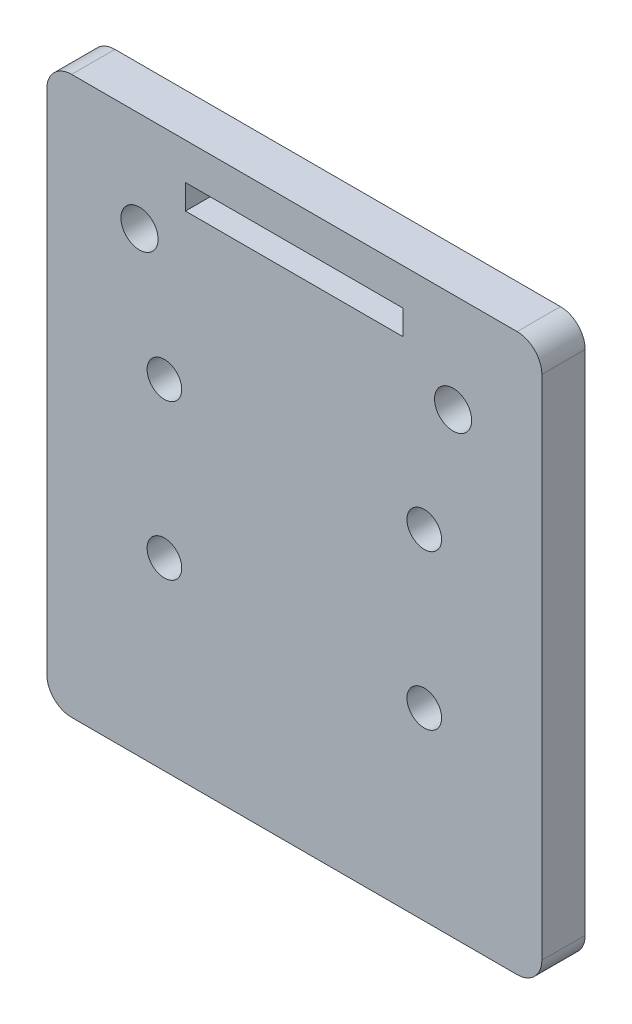
ISO-10303-21;
HEADER;
FILE_DESCRIPTION(('STEP AP214'),'2;1');
FILE_NAME('part.step','',(''),(''),'','','');
FILE_SCHEMA(('AUTOMOTIVE_DESIGN { 1 0 10303 214 1 1 1 1 }'));
ENDSEC;
DATA;
#1=APPLICATION_CONTEXT('core data for automotive mechanical design processes');
#2=APPLICATION_PROTOCOL_DEFINITION('international standard','automotive_design',2000,#1);
#3=PRODUCT_CONTEXT('',#1,'mechanical');
#4=PRODUCT('Part','Part','',(#3));
#5=PRODUCT_RELATED_PRODUCT_CATEGORY('part','',(#4));
#6=PRODUCT_DEFINITION_FORMATION('','',#4);
#7=PRODUCT_DEFINITION_CONTEXT('part definition',#1,'design');
#8=PRODUCT_DEFINITION('design','',#6,#7);
#9=PRODUCT_DEFINITION_SHAPE('','',#8);
#10=(LENGTH_UNIT() NAMED_UNIT(*) SI_UNIT(.MILLI.,.METRE.));
#11=(NAMED_UNIT(*) PLANE_ANGLE_UNIT() SI_UNIT($,.RADIAN.));
#12=(NAMED_UNIT(*) SI_UNIT($,.STERADIAN.) SOLID_ANGLE_UNIT());
#13=UNCERTAINTY_MEASURE_WITH_UNIT(LENGTH_MEASURE(1.E-05),#10,'distance_accuracy_value','');
#14=(GEOMETRIC_REPRESENTATION_CONTEXT(3) GLOBAL_UNCERTAINTY_ASSIGNED_CONTEXT((#13)) GLOBAL_UNIT_ASSIGNED_CONTEXT((#10,
#11,#12)) REPRESENTATION_CONTEXT('',''));
#15=CARTESIAN_POINT('',(0.,0.,0.));
#16=DIRECTION('',(0.,0.,1.));
#17=DIRECTION('',(1.,0.,0.));
#18=AXIS2_PLACEMENT_3D('',#15,#16,#17);
#19=CARTESIAN_POINT('',(-2.,2.,3.5));
#20=DIRECTION('',(0.,0.,1.));
#21=DIRECTION('',(1.,0.,0.));
#22=AXIS2_PLACEMENT_3D('',#19,#20,#21);
#23=PLANE('',#22);
#24=CARTESIAN_POINT('',(-30.5,14.9062418521104,3.5));
#25=DIRECTION('',(0.,0.,1.));
#26=DIRECTION('',(1.,0.,0.));
#27=AXIS2_PLACEMENT_3D('',#24,#25,#26);
#28=CIRCLE('',#27,1.4);
#29=CARTESIAN_POINT('',(-29.1,14.9062418521104,3.5));
#30=VERTEX_POINT('',#29);
#31=EDGE_CURVE('E388',#30,#30,#28,.F.);
#32=ORIENTED_EDGE('',*,*,#31,.T.);
#33=EDGE_LOOP('',(#32));
#34=FACE_BOUND('',#33,.T.);
#35=CARTESIAN_POINT('',(-30.5,27.4062418521104,3.5));
#36=DIRECTION('',(0.,0.,1.));
#37=DIRECTION('',(1.,0.,0.));
#38=AXIS2_PLACEMENT_3D('',#35,#36,#37);
#39=CIRCLE('',#38,1.4);
#40=CARTESIAN_POINT('',(-29.1,27.4062418521104,3.5));
#41=VERTEX_POINT('',#40);
#42=EDGE_CURVE('E364',#41,#41,#39,.T.);
#43=ORIENTED_EDGE('',*,*,#42,.F.);
#44=EDGE_LOOP('',(#43));
#45=FACE_BOUND('',#44,.T.);
#46=CARTESIAN_POINT('',(-32.5126214309686,36.9534172161279,3.5));
#47=DIRECTION('',(0.,0.,1.));
#48=DIRECTION('',(1.,0.,0.));
#49=AXIS2_PLACEMENT_3D('',#46,#47,#48);
#50=CIRCLE('',#49,1.5);
#51=CARTESIAN_POINT('',(-31.0126214309686,36.9534172161279,3.5));
#52=VERTEX_POINT('',#51);
#53=EDGE_CURVE('E354',#52,#52,#50,.T.);
#54=ORIENTED_EDGE('',*,*,#53,.F.);
#55=EDGE_LOOP('',(#54));
#56=FACE_BOUND('',#55,.T.);
#57=CARTESIAN_POINT('',(-7.17262143096858,36.9534172161279,3.5));
#58=DIRECTION('',(0.,0.,1.));
#59=DIRECTION('',(1.,0.,0.));
#60=AXIS2_PLACEMENT_3D('',#57,#58,#59);
#61=CIRCLE('',#60,1.5);
#62=CARTESIAN_POINT('',(-5.67262143096858,36.9534172161279,3.5));
#63=VERTEX_POINT('',#62);
#64=EDGE_CURVE('E351',#63,#63,#61,.T.);
#65=ORIENTED_EDGE('',*,*,#64,.F.);
#66=EDGE_LOOP('',(#65));
#67=FACE_BOUND('',#66,.T.);
#68=DIRECTION('',(0.,-1.,0.));
#69=VECTOR('',#68,1.);
#70=CARTESIAN_POINT('',(-28.8,0.,3.5));
#71=LINE('',#70,#69);
#72=CARTESIAN_POINT('',(-28.8,42.0339468170796,3.5));
#73=VERTEX_POINT('',#72);
#74=CARTESIAN_POINT('',(-28.8,40.0339468170796,3.5));
#75=VERTEX_POINT('',#74);
#76=EDGE_CURVE('E55',#73,#75,#71,.T.);
#77=ORIENTED_EDGE('',*,*,#76,.F.);
#78=DIRECTION('',(1.,0.,0.));
#79=VECTOR('',#78,1.);
#80=CARTESIAN_POINT('',(0.,42.0339468170796,3.5));
#81=LINE('',#80,#79);
#82=CARTESIAN_POINT('',(-11.2,42.0339468170796,3.5));
#83=VERTEX_POINT('',#82);
#84=EDGE_CURVE('E148',#73,#83,#81,.T.);
#85=ORIENTED_EDGE('',*,*,#84,.T.);
#86=DIRECTION('',(0.,-1.,0.));
#87=VECTOR('',#86,1.);
#88=CARTESIAN_POINT('',(-11.2,0.,3.5));
#89=LINE('',#88,#87);
#90=CARTESIAN_POINT('',(-11.2,40.0339468170796,3.5));
#91=VERTEX_POINT('',#90);
#92=EDGE_CURVE('E152',#83,#91,#89,.T.);
#93=ORIENTED_EDGE('',*,*,#92,.T.);
#94=DIRECTION('',(1.,0.,0.));
#95=VECTOR('',#94,1.);
#96=CARTESIAN_POINT('',(0.,40.0339468170796,3.5));
#97=LINE('',#96,#95);
#98=EDGE_CURVE('E164',#75,#91,#97,.T.);
#99=ORIENTED_EDGE('',*,*,#98,.F.);
#100=EDGE_LOOP('',(#77,#85,#93,#99));
#101=FACE_BOUND('',#100,.T.);
#102=CARTESIAN_POINT('',(-2.,2.,3.5));
#103=DIRECTION('',(0.,0.,1.));
#104=DIRECTION('',(1.,0.,0.));
#105=AXIS2_PLACEMENT_3D('',#102,#103,#104);
#106=CIRCLE('',#105,2.);
#107=CARTESIAN_POINT('',(-2.00000000000001,0.,3.5));
#108=VERTEX_POINT('',#107);
#109=CARTESIAN_POINT('',(0.,2.00000000000001,3.5));
#110=VERTEX_POINT('',#109);
#111=EDGE_CURVE('E180',#108,#110,#106,.T.);
#112=ORIENTED_EDGE('',*,*,#111,.T.);
#113=DIRECTION('',(0.,1.,0.));
#114=VECTOR('',#113,1.);
#115=CARTESIAN_POINT('',(0.,2.00000000000001,3.5));
#116=LINE('',#115,#114);
#117=CARTESIAN_POINT('',(0.,42.999999916,3.5));
#118=VERTEX_POINT('',#117);
#119=EDGE_CURVE('E184',#110,#118,#116,.T.);
#120=ORIENTED_EDGE('',*,*,#119,.T.);
#121=CARTESIAN_POINT('',(-2.,42.999999916,3.5));
#122=DIRECTION('',(0.,0.,-1.));
#123=DIRECTION('',(-1.,0.,0.));
#124=AXIS2_PLACEMENT_3D('',#121,#122,#123);
#125=CIRCLE('',#124,2.);
#126=CARTESIAN_POINT('',(-2.00000000000001,44.999999916,3.5));
#127=VERTEX_POINT('',#126);
#128=EDGE_CURVE('E188',#127,#118,#125,.T.);
#129=ORIENTED_EDGE('',*,*,#128,.F.);
#130=DIRECTION('',(-1.,0.,0.));
#131=VECTOR('',#130,1.);
#132=CARTESIAN_POINT('',(-2.00000000000001,44.999999916,3.5));
#133=LINE('',#132,#131);
#134=CARTESIAN_POINT('',(-38.,44.999999916,3.5));
#135=VERTEX_POINT('',#134);
#136=EDGE_CURVE('E192',#127,#135,#133,.T.);
#137=ORIENTED_EDGE('',*,*,#136,.T.);
#138=CARTESIAN_POINT('',(-38.,42.999999916,3.5));
#139=DIRECTION('',(0.,0.,1.));
#140=DIRECTION('',(1.,0.,0.));
#141=AXIS2_PLACEMENT_3D('',#138,#139,#140);
#142=CIRCLE('',#141,2.);
#143=CARTESIAN_POINT('',(-40.,42.999999916,3.5));
#144=VERTEX_POINT('',#143);
#145=EDGE_CURVE('E195',#135,#144,#142,.T.);
#146=ORIENTED_EDGE('',*,*,#145,.T.);
#147=DIRECTION('',(0.,1.,0.));
#148=VECTOR('',#147,1.);
#149=CARTESIAN_POINT('',(-40.,2.00000000000001,3.5));
#150=LINE('',#149,#148);
#151=CARTESIAN_POINT('',(-40.,2.00000000000001,3.5));
#152=VERTEX_POINT('',#151);
#153=EDGE_CURVE('E198',#152,#144,#150,.T.);
#154=ORIENTED_EDGE('',*,*,#153,.F.);
#155=CARTESIAN_POINT('',(-38.,2.,3.5));
#156=DIRECTION('',(0.,0.,1.));
#157=DIRECTION('',(1.,0.,0.));
#158=AXIS2_PLACEMENT_3D('',#155,#156,#157);
#159=CIRCLE('',#158,2.);
#160=CARTESIAN_POINT('',(-38.,0.,3.5));
#161=VERTEX_POINT('',#160);
#162=EDGE_CURVE('E202',#152,#161,#159,.T.);
#163=ORIENTED_EDGE('',*,*,#162,.T.);
#164=DIRECTION('',(-1.,0.,0.));
#165=VECTOR('',#164,1.);
#166=CARTESIAN_POINT('',(-2.00000000000001,0.,3.5));
#167=LINE('',#166,#165);
#168=EDGE_CURVE('E205',#108,#161,#167,.T.);
#169=ORIENTED_EDGE('',*,*,#168,.F.);
#170=EDGE_LOOP('',(#112,#120,#129,#137,#146,#154,#163,#169));
#171=FACE_BOUND('',#170,.T.);
#172=CARTESIAN_POINT('',(-9.5,14.9062418521104,3.5));
#173=DIRECTION('',(0.,0.,1.));
#174=DIRECTION('',(1.,0.,0.));
#175=AXIS2_PLACEMENT_3D('',#172,#173,#174);
#176=CIRCLE('',#175,1.4);
#177=CARTESIAN_POINT('',(-8.1,14.9062418521104,3.5));
#178=VERTEX_POINT('',#177);
#179=EDGE_CURVE('E380',#178,#178,#176,.T.);
#180=ORIENTED_EDGE('',*,*,#179,.F.);
#181=EDGE_LOOP('',(#180));
#182=FACE_BOUND('',#181,.T.);
#183=CARTESIAN_POINT('',(-9.5,27.4062418521104,3.5));
#184=DIRECTION('',(0.,0.,1.));
#185=DIRECTION('',(1.,0.,0.));
#186=AXIS2_PLACEMENT_3D('',#183,#184,#185);
#187=CIRCLE('',#186,1.4);
#188=CARTESIAN_POINT('',(-8.1,27.4062418521104,3.5));
#189=VERTEX_POINT('',#188);
#190=EDGE_CURVE('E372',#189,#189,#187,.F.);
#191=ORIENTED_EDGE('',*,*,#190,.T.);
#192=EDGE_LOOP('',(#191));
#193=FACE_BOUND('',#192,.T.);
#194=ADVANCED_FACE('F39',(#34,#45,#56,#67,#101,#171,#182,#193),#23,.T.);
#195=CARTESIAN_POINT('',(-2.,2.,0.));
#196=DIRECTION('',(0.,0.,1.));
#197=DIRECTION('',(1.,0.,0.));
#198=AXIS2_PLACEMENT_3D('',#195,#196,#197);
#199=PLANE('',#198);
#200=CARTESIAN_POINT('',(-9.5,14.9062418521104,0.));
#201=DIRECTION('',(0.,0.,1.));
#202=DIRECTION('',(1.,0.,0.));
#203=AXIS2_PLACEMENT_3D('',#200,#201,#202);
#204=CIRCLE('',#203,1.4);
#205=CARTESIAN_POINT('',(-8.1,14.9062418521104,0.));
#206=VERTEX_POINT('',#205);
#207=EDGE_CURVE('E384',#206,#206,#204,.T.);
#208=ORIENTED_EDGE('',*,*,#207,.T.);
#209=EDGE_LOOP('',(#208));
#210=FACE_BOUND('',#209,.T.);
#211=CARTESIAN_POINT('',(-30.5,27.4062418521104,0.));
#212=DIRECTION('',(0.,0.,1.));
#213=DIRECTION('',(1.,0.,0.));
#214=AXIS2_PLACEMENT_3D('',#211,#212,#213);
#215=CIRCLE('',#214,1.4);
#216=CARTESIAN_POINT('',(-29.1,27.4062418521104,0.));
#217=VERTEX_POINT('',#216);
#218=EDGE_CURVE('E359',#217,#217,#215,.T.);
#219=ORIENTED_EDGE('',*,*,#218,.T.);
#220=EDGE_LOOP('',(#219));
#221=FACE_BOUND('',#220,.T.);
#222=CARTESIAN_POINT('',(-32.5126214309686,36.9534172161279,0.));
#223=DIRECTION('',(0.,0.,1.));
#224=DIRECTION('',(1.,0.,0.));
#225=AXIS2_PLACEMENT_3D('',#222,#223,#224);
#226=CIRCLE('',#225,1.5);
#227=CARTESIAN_POINT('',(-31.0126214309686,36.9534172161279,0.));
#228=VERTEX_POINT('',#227);
#229=EDGE_CURVE('E165',#228,#228,#226,.T.);
#230=ORIENTED_EDGE('',*,*,#229,.T.);
#231=EDGE_LOOP('',(#230));
#232=FACE_BOUND('',#231,.T.);
#233=CARTESIAN_POINT('',(-7.17262143096858,36.9534172161279,0.));
#234=DIRECTION('',(0.,0.,1.));
#235=DIRECTION('',(1.,0.,0.));
#236=AXIS2_PLACEMENT_3D('',#233,#234,#235);
#237=CIRCLE('',#236,1.5);
#238=CARTESIAN_POINT('',(-5.67262143096858,36.9534172161279,0.));
#239=VERTEX_POINT('',#238);
#240=EDGE_CURVE('E155',#239,#239,#237,.T.);
#241=ORIENTED_EDGE('',*,*,#240,.T.);
#242=EDGE_LOOP('',(#241));
#243=FACE_BOUND('',#242,.T.);
#244=DIRECTION('',(1.,0.,0.));
#245=VECTOR('',#244,1.);
#246=CARTESIAN_POINT('',(0.,42.0339468170796,0.));
#247=LINE('',#246,#245);
#248=CARTESIAN_POINT('',(-28.8,42.0339468170796,0.));
#249=VERTEX_POINT('',#248);
#250=CARTESIAN_POINT('',(-11.2,42.0339468170796,0.));
#251=VERTEX_POINT('',#250);
#252=EDGE_CURVE('E135',#249,#251,#247,.T.);
#253=ORIENTED_EDGE('',*,*,#252,.F.);
#254=DIRECTION('',(0.,-1.,0.));
#255=VECTOR('',#254,1.);
#256=CARTESIAN_POINT('',(-28.8,0.,0.));
#257=LINE('',#256,#255);
#258=CARTESIAN_POINT('',(-28.8,40.0339468170796,0.));
#259=VERTEX_POINT('',#258);
#260=EDGE_CURVE('E131',#249,#259,#257,.T.);
#261=ORIENTED_EDGE('',*,*,#260,.T.);
#262=DIRECTION('',(1.,0.,0.));
#263=VECTOR('',#262,1.);
#264=CARTESIAN_POINT('',(0.,40.0339468170796,0.));
#265=LINE('',#264,#263);
#266=CARTESIAN_POINT('',(-11.2,40.0339468170796,0.));
#267=VERTEX_POINT('',#266);
#268=EDGE_CURVE('E138',#259,#267,#265,.T.);
#269=ORIENTED_EDGE('',*,*,#268,.T.);
#270=DIRECTION('',(0.,-1.,0.));
#271=VECTOR('',#270,1.);
#272=CARTESIAN_POINT('',(-11.2,0.,0.));
#273=LINE('',#272,#271);
#274=EDGE_CURVE('E143',#251,#267,#273,.T.);
#275=ORIENTED_EDGE('',*,*,#274,.F.);
#276=EDGE_LOOP('',(#253,#261,#269,#275));
#277=FACE_BOUND('',#276,.T.);
#278=CARTESIAN_POINT('',(-2.,2.,0.));
#279=DIRECTION('',(0.,0.,1.));
#280=DIRECTION('',(1.,0.,0.));
#281=AXIS2_PLACEMENT_3D('',#278,#279,#280);
#282=CIRCLE('',#281,2.);
#283=CARTESIAN_POINT('',(-2.00000000000001,0.,0.));
#284=VERTEX_POINT('',#283);
#285=CARTESIAN_POINT('',(0.,2.00000000000001,0.));
#286=VERTEX_POINT('',#285);
#287=EDGE_CURVE('E174',#284,#286,#282,.T.);
#288=ORIENTED_EDGE('',*,*,#287,.F.);
#289=DIRECTION('',(-1.,0.,0.));
#290=VECTOR('',#289,1.);
#291=CARTESIAN_POINT('',(-2.00000000000001,0.,0.));
#292=LINE('',#291,#290);
#293=CARTESIAN_POINT('',(-38.,0.,0.));
#294=VERTEX_POINT('',#293);
#295=EDGE_CURVE('E185',#284,#294,#292,.T.);
#296=ORIENTED_EDGE('',*,*,#295,.T.);
#297=CARTESIAN_POINT('',(-38.,2.,0.));
#298=DIRECTION('',(0.,0.,1.));
#299=DIRECTION('',(1.,0.,0.));
#300=AXIS2_PLACEMENT_3D('',#297,#298,#299);
#301=CIRCLE('',#300,2.);
#302=CARTESIAN_POINT('',(-40.,2.00000000000001,0.));
#303=VERTEX_POINT('',#302);
#304=EDGE_CURVE('E232',#303,#294,#301,.T.);
#305=ORIENTED_EDGE('',*,*,#304,.F.);
#306=DIRECTION('',(0.,1.,0.));
#307=VECTOR('',#306,1.);
#308=CARTESIAN_POINT('',(-40.,2.00000000000001,0.));
#309=LINE('',#308,#307);
#310=CARTESIAN_POINT('',(-40.,42.999999916,0.));
#311=VERTEX_POINT('',#310);
#312=EDGE_CURVE('E228',#303,#311,#309,.T.);
#313=ORIENTED_EDGE('',*,*,#312,.T.);
#314=CARTESIAN_POINT('',(-38.,42.999999916,0.));
#315=DIRECTION('',(0.,0.,1.));
#316=DIRECTION('',(1.,0.,0.));
#317=AXIS2_PLACEMENT_3D('',#314,#315,#316);
#318=CIRCLE('',#317,2.);
#319=CARTESIAN_POINT('',(-38.,44.999999916,0.));
#320=VERTEX_POINT('',#319);
#321=EDGE_CURVE('E224',#320,#311,#318,.T.);
#322=ORIENTED_EDGE('',*,*,#321,.F.);
#323=DIRECTION('',(-1.,0.,0.));
#324=VECTOR('',#323,1.);
#325=CARTESIAN_POINT('',(-2.00000000000001,44.999999916,0.));
#326=LINE('',#325,#324);
#327=CARTESIAN_POINT('',(-2.00000000000001,44.999999916,0.));
#328=VERTEX_POINT('',#327);
#329=EDGE_CURVE('E221',#328,#320,#326,.T.);
#330=ORIENTED_EDGE('',*,*,#329,.F.);
#331=CARTESIAN_POINT('',(-2.,42.999999916,0.));
#332=DIRECTION('',(0.,0.,-1.));
#333=DIRECTION('',(-1.,0.,0.));
#334=AXIS2_PLACEMENT_3D('',#331,#332,#333);
#335=CIRCLE('',#334,2.);
#336=CARTESIAN_POINT('',(0.,42.999999916,0.));
#337=VERTEX_POINT('',#336);
#338=EDGE_CURVE('E217',#328,#337,#335,.T.);
#339=ORIENTED_EDGE('',*,*,#338,.T.);
#340=DIRECTION('',(0.,1.,0.));
#341=VECTOR('',#340,1.);
#342=CARTESIAN_POINT('',(0.,2.00000000000001,0.));
#343=LINE('',#342,#341);
#344=EDGE_CURVE('E213',#286,#337,#343,.T.);
#345=ORIENTED_EDGE('',*,*,#344,.F.);
#346=EDGE_LOOP('',(#288,#296,#305,#313,#322,#330,#339,#345));
#347=FACE_BOUND('',#346,.T.);
#348=CARTESIAN_POINT('',(-30.5,14.9062418521104,0.));
#349=DIRECTION('',(0.,0.,1.));
#350=DIRECTION('',(1.,0.,0.));
#351=AXIS2_PLACEMENT_3D('',#348,#349,#350);
#352=CIRCLE('',#351,1.4);
#353=CARTESIAN_POINT('',(-29.1,14.9062418521104,0.));
#354=VERTEX_POINT('',#353);
#355=EDGE_CURVE('E368',#354,#354,#352,.F.);
#356=ORIENTED_EDGE('',*,*,#355,.F.);
#357=EDGE_LOOP('',(#356));
#358=FACE_BOUND('',#357,.T.);
#359=CARTESIAN_POINT('',(-9.5,27.4062418521104,0.));
#360=DIRECTION('',(0.,0.,1.));
#361=DIRECTION('',(1.,0.,0.));
#362=AXIS2_PLACEMENT_3D('',#359,#360,#361);
#363=CIRCLE('',#362,1.4);
#364=CARTESIAN_POINT('',(-8.1,27.4062418521104,0.));
#365=VERTEX_POINT('',#364);
#366=EDGE_CURVE('E376',#365,#365,#363,.F.);
#367=ORIENTED_EDGE('',*,*,#366,.F.);
#368=EDGE_LOOP('',(#367));
#369=FACE_BOUND('',#368,.T.);
#370=ADVANCED_FACE('F145',(#210,#221,#232,#243,#277,#347,#358,#369),#199,.F.);
#371=CARTESIAN_POINT('',(-2.,2.,3.5));
#372=DIRECTION('',(0.,0.,-1.));
#373=DIRECTION('',(-1.,0.,0.));
#374=AXIS2_PLACEMENT_3D('',#371,#372,#373);
#375=CYLINDRICAL_SURFACE('',#374,2.);
#376=ORIENTED_EDGE('',*,*,#287,.T.);
#377=DIRECTION('',(0.,0.,-1.));
#378=VECTOR('',#377,1.);
#379=CARTESIAN_POINT('',(0.,2.00000000000001,3.5));
#380=LINE('',#379,#378);
#381=EDGE_CURVE('E11',#110,#286,#380,.T.);
#382=ORIENTED_EDGE('',*,*,#381,.F.);
#383=ORIENTED_EDGE('',*,*,#111,.F.);
#384=DIRECTION('',(0.,0.,-1.));
#385=VECTOR('',#384,1.);
#386=CARTESIAN_POINT('',(-2.00000000000001,0.,3.5));
#387=LINE('',#386,#385);
#388=EDGE_CURVE('E209',#108,#284,#387,.T.);
#389=ORIENTED_EDGE('',*,*,#388,.T.);
#390=EDGE_LOOP('',(#376,#382,#383,#389));
#391=FACE_BOUND('',#390,.T.);
#392=ADVANCED_FACE('F41',(#391),#375,.T.);
#393=CARTESIAN_POINT('',(0.,2.00000000000001,3.5));
#394=DIRECTION('',(-1.,0.,0.));
#395=DIRECTION('',(0.,-1.,0.));
#396=AXIS2_PLACEMENT_3D('',#393,#394,#395);
#397=PLANE('',#396);
#398=ORIENTED_EDGE('',*,*,#344,.T.);
#399=DIRECTION('',(0.,0.,-1.));
#400=VECTOR('',#399,1.);
#401=CARTESIAN_POINT('',(0.,42.999999916,3.5));
#402=LINE('',#401,#400);
#403=EDGE_CURVE('E48',#118,#337,#402,.T.);
#404=ORIENTED_EDGE('',*,*,#403,.F.);
#405=ORIENTED_EDGE('',*,*,#119,.F.);
#406=ORIENTED_EDGE('',*,*,#381,.T.);
#407=EDGE_LOOP('',(#398,#404,#405,#406));
#408=FACE_BOUND('',#407,.T.);
#409=ADVANCED_FACE('F263',(#408),#397,.F.);
#410=CARTESIAN_POINT('',(-2.,42.999999916,3.5));
#411=DIRECTION('',(0.,0.,-1.));
#412=DIRECTION('',(-1.,0.,0.));
#413=AXIS2_PLACEMENT_3D('',#410,#411,#412);
#414=CYLINDRICAL_SURFACE('',#413,2.);
#415=ORIENTED_EDGE('',*,*,#338,.F.);
#416=DIRECTION('',(0.,0.,-1.));
#417=VECTOR('',#416,1.);
#418=CARTESIAN_POINT('',(-2.00000000000001,44.999999916,3.5));
#419=LINE('',#418,#417);
#420=EDGE_CURVE('E254',#127,#328,#419,.T.);
#421=ORIENTED_EDGE('',*,*,#420,.F.);
#422=ORIENTED_EDGE('',*,*,#128,.T.);
#423=ORIENTED_EDGE('',*,*,#403,.T.);
#424=EDGE_LOOP('',(#415,#421,#422,#423));
#425=FACE_BOUND('',#424,.T.);
#426=ADVANCED_FACE('F260',(#425),#414,.T.);
#427=CARTESIAN_POINT('',(-2.00000000000001,44.999999916,3.5));
#428=DIRECTION('',(0.,-1.,0.));
#429=DIRECTION('',(1.,0.,0.));
#430=AXIS2_PLACEMENT_3D('',#427,#428,#429);
#431=PLANE('',#430);
#432=ORIENTED_EDGE('',*,*,#329,.T.);
#433=DIRECTION('',(0.,0.,-1.));
#434=VECTOR('',#433,1.);
#435=CARTESIAN_POINT('',(-38.,44.999999916,3.5));
#436=LINE('',#435,#434);
#437=EDGE_CURVE('E250',#135,#320,#436,.T.);
#438=ORIENTED_EDGE('',*,*,#437,.F.);
#439=ORIENTED_EDGE('',*,*,#136,.F.);
#440=ORIENTED_EDGE('',*,*,#420,.T.);
#441=EDGE_LOOP('',(#432,#438,#439,#440));
#442=FACE_BOUND('',#441,.T.);
#443=ADVANCED_FACE('F271',(#442),#431,.F.);
#444=CARTESIAN_POINT('',(-38.,42.999999916,3.5));
#445=DIRECTION('',(0.,0.,-1.));
#446=DIRECTION('',(-1.,0.,0.));
#447=AXIS2_PLACEMENT_3D('',#444,#445,#446);
#448=CYLINDRICAL_SURFACE('',#447,2.);
#449=ORIENTED_EDGE('',*,*,#321,.T.);
#450=DIRECTION('',(0.,0.,-1.));
#451=VECTOR('',#450,1.);
#452=CARTESIAN_POINT('',(-40.,42.999999916,3.5));
#453=LINE('',#452,#451);
#454=EDGE_CURVE('E247',#144,#311,#453,.T.);
#455=ORIENTED_EDGE('',*,*,#454,.F.);
#456=ORIENTED_EDGE('',*,*,#145,.F.);
#457=ORIENTED_EDGE('',*,*,#437,.T.);
#458=EDGE_LOOP('',(#449,#455,#456,#457));
#459=FACE_BOUND('',#458,.T.);
#460=ADVANCED_FACE('F275',(#459),#448,.T.);
#461=CARTESIAN_POINT('',(-40.,2.00000000000001,3.5));
#462=DIRECTION('',(-1.,0.,0.));
#463=DIRECTION('',(0.,0.,1.));
#464=AXIS2_PLACEMENT_3D('',#461,#462,#463);
#465=PLANE('',#464);
#466=ORIENTED_EDGE('',*,*,#312,.F.);
#467=DIRECTION('',(0.,0.,-1.));
#468=VECTOR('',#467,1.);
#469=CARTESIAN_POINT('',(-40.,2.00000000000001,3.5));
#470=LINE('',#469,#468);
#471=EDGE_CURVE('E244',#152,#303,#470,.T.);
#472=ORIENTED_EDGE('',*,*,#471,.F.);
#473=ORIENTED_EDGE('',*,*,#153,.T.);
#474=ORIENTED_EDGE('',*,*,#454,.T.);
#475=EDGE_LOOP('',(#466,#472,#473,#474));
#476=FACE_BOUND('',#475,.T.);
#477=ADVANCED_FACE('F293',(#476),#465,.T.);
#478=CARTESIAN_POINT('',(-38.,2.,3.5));
#479=DIRECTION('',(0.,0.,-1.));
#480=DIRECTION('',(-1.,0.,0.));
#481=AXIS2_PLACEMENT_3D('',#478,#479,#480);
#482=CYLINDRICAL_SURFACE('',#481,2.);
#483=ORIENTED_EDGE('',*,*,#304,.T.);
#484=DIRECTION('',(0.,0.,-1.));
#485=VECTOR('',#484,1.);
#486=CARTESIAN_POINT('',(-38.,0.,3.5));
#487=LINE('',#486,#485);
#488=EDGE_CURVE('E241',#161,#294,#487,.T.);
#489=ORIENTED_EDGE('',*,*,#488,.F.);
#490=ORIENTED_EDGE('',*,*,#162,.F.);
#491=ORIENTED_EDGE('',*,*,#471,.T.);
#492=EDGE_LOOP('',(#483,#489,#490,#491));
#493=FACE_BOUND('',#492,.T.);
#494=ADVANCED_FACE('F290',(#493),#482,.T.);
#495=CARTESIAN_POINT('',(-2.00000000000001,0.,3.5));
#496=DIRECTION('',(0.,-1.,0.));
#497=DIRECTION('',(0.,0.,-1.));
#498=AXIS2_PLACEMENT_3D('',#495,#496,#497);
#499=PLANE('',#498);
#500=ORIENTED_EDGE('',*,*,#295,.F.);
#501=ORIENTED_EDGE('',*,*,#388,.F.);
#502=ORIENTED_EDGE('',*,*,#168,.T.);
#503=ORIENTED_EDGE('',*,*,#488,.T.);
#504=EDGE_LOOP('',(#500,#501,#502,#503));
#505=FACE_BOUND('',#504,.T.);
#506=ADVANCED_FACE('F286',(#505),#499,.T.);
#507=CARTESIAN_POINT('',(-28.8,0.,0.));
#508=DIRECTION('',(-1.,0.,0.));
#509=DIRECTION('',(0.,0.,1.));
#510=AXIS2_PLACEMENT_3D('',#507,#508,#509);
#511=PLANE('',#510);
#512=ORIENTED_EDGE('',*,*,#76,.T.);
#513=DIRECTION('',(0.,0.,1.));
#514=VECTOR('',#513,1.);
#515=CARTESIAN_POINT('',(-28.8,40.0339468170796,0.));
#516=LINE('',#515,#514);
#517=EDGE_CURVE('E128',#259,#75,#516,.T.);
#518=ORIENTED_EDGE('',*,*,#517,.F.);
#519=ORIENTED_EDGE('',*,*,#260,.F.);
#520=DIRECTION('',(0.,0.,1.));
#521=VECTOR('',#520,1.);
#522=CARTESIAN_POINT('',(-28.8,42.0339468170796,0.));
#523=LINE('',#522,#521);
#524=EDGE_CURVE('E171',#249,#73,#523,.T.);
#525=ORIENTED_EDGE('',*,*,#524,.T.);
#526=EDGE_LOOP('',(#512,#518,#519,#525));
#527=FACE_BOUND('',#526,.T.);
#528=ADVANCED_FACE('F129',(#527),#511,.F.);
#529=CARTESIAN_POINT('',(0.,42.0339468170796,0.));
#530=DIRECTION('',(0.,-1.,0.));
#531=DIRECTION('',(0.,0.,-1.));
#532=AXIS2_PLACEMENT_3D('',#529,#530,#531);
#533=PLANE('',#532);
#534=ORIENTED_EDGE('',*,*,#84,.F.);
#535=ORIENTED_EDGE('',*,*,#524,.F.);
#536=ORIENTED_EDGE('',*,*,#252,.T.);
#537=DIRECTION('',(0.,0.,1.));
#538=VECTOR('',#537,1.);
#539=CARTESIAN_POINT('',(-11.2,42.0339468170796,0.));
#540=LINE('',#539,#538);
#541=EDGE_CURVE('E175',#251,#83,#540,.T.);
#542=ORIENTED_EDGE('',*,*,#541,.T.);
#543=EDGE_LOOP('',(#534,#535,#536,#542));
#544=FACE_BOUND('',#543,.T.);
#545=ADVANCED_FACE('F319',(#544),#533,.T.);
#546=CARTESIAN_POINT('',(-11.2,0.,0.));
#547=DIRECTION('',(-1.,0.,0.));
#548=DIRECTION('',(0.,-1.,0.));
#549=AXIS2_PLACEMENT_3D('',#546,#547,#548);
#550=PLANE('',#549);
#551=ORIENTED_EDGE('',*,*,#92,.F.);
#552=ORIENTED_EDGE('',*,*,#541,.F.);
#553=ORIENTED_EDGE('',*,*,#274,.T.);
#554=DIRECTION('',(0.,0.,1.));
#555=VECTOR('',#554,1.);
#556=CARTESIAN_POINT('',(-11.2,40.0339468170796,0.));
#557=LINE('',#556,#555);
#558=EDGE_CURVE('E63',#267,#91,#557,.T.);
#559=ORIENTED_EDGE('',*,*,#558,.T.);
#560=EDGE_LOOP('',(#551,#552,#553,#559));
#561=FACE_BOUND('',#560,.T.);
#562=ADVANCED_FACE('F323',(#561),#550,.T.);
#563=CARTESIAN_POINT('',(0.,40.0339468170796,0.));
#564=DIRECTION('',(0.,-1.,0.));
#565=DIRECTION('',(0.,0.,-1.));
#566=AXIS2_PLACEMENT_3D('',#563,#564,#565);
#567=PLANE('',#566);
#568=ORIENTED_EDGE('',*,*,#98,.T.);
#569=ORIENTED_EDGE('',*,*,#558,.F.);
#570=ORIENTED_EDGE('',*,*,#268,.F.);
#571=ORIENTED_EDGE('',*,*,#517,.T.);
#572=EDGE_LOOP('',(#568,#569,#570,#571));
#573=FACE_BOUND('',#572,.T.);
#574=ADVANCED_FACE('F139',(#573),#567,.F.);
#575=CARTESIAN_POINT('',(-7.17262143096858,36.9534172161279,0.));
#576=DIRECTION('',(0.,0.,1.));
#577=DIRECTION('',(1.,0.,0.));
#578=AXIS2_PLACEMENT_3D('',#575,#576,#577);
#579=CYLINDRICAL_SURFACE('',#578,1.5);
#580=ORIENTED_EDGE('',*,*,#240,.F.);
#581=EDGE_LOOP('',(#580));
#582=FACE_BOUND('',#581,.T.);
#583=ORIENTED_EDGE('',*,*,#64,.T.);
#584=EDGE_LOOP('',(#583));
#585=FACE_BOUND('',#584,.T.);
#586=ADVANCED_FACE('F333',(#582,#585),#579,.F.);
#587=CARTESIAN_POINT('',(-32.5126214309686,36.9534172161279,0.));
#588=DIRECTION('',(0.,0.,1.));
#589=DIRECTION('',(1.,0.,0.));
#590=AXIS2_PLACEMENT_3D('',#587,#588,#589);
#591=CYLINDRICAL_SURFACE('',#590,1.5);
#592=ORIENTED_EDGE('',*,*,#229,.F.);
#593=EDGE_LOOP('',(#592));
#594=FACE_BOUND('',#593,.T.);
#595=ORIENTED_EDGE('',*,*,#53,.T.);
#596=EDGE_LOOP('',(#595));
#597=FACE_BOUND('',#596,.T.);
#598=ADVANCED_FACE('F339',(#594,#597),#591,.F.);
#599=CARTESIAN_POINT('',(-30.5,27.4062418521104,0.));
#600=DIRECTION('',(0.,0.,1.));
#601=DIRECTION('',(1.,0.,0.));
#602=AXIS2_PLACEMENT_3D('',#599,#600,#601);
#603=CYLINDRICAL_SURFACE('',#602,1.4);
#604=ORIENTED_EDGE('',*,*,#218,.F.);
#605=EDGE_LOOP('',(#604));
#606=FACE_BOUND('',#605,.T.);
#607=ORIENTED_EDGE('',*,*,#42,.T.);
#608=EDGE_LOOP('',(#607));
#609=FACE_BOUND('',#608,.T.);
#610=ADVANCED_FACE('F344',(#606,#609),#603,.F.);
#611=CARTESIAN_POINT('',(-30.5,14.9062418521104,0.));
#612=DIRECTION('',(0.,0.,1.));
#613=DIRECTION('',(1.,0.,0.));
#614=AXIS2_PLACEMENT_3D('',#611,#612,#613);
#615=CYLINDRICAL_SURFACE('',#614,1.4);
#616=ORIENTED_EDGE('',*,*,#355,.T.);
#617=EDGE_LOOP('',(#616));
#618=FACE_BOUND('',#617,.T.);
#619=ORIENTED_EDGE('',*,*,#31,.F.);
#620=EDGE_LOOP('',(#619));
#621=FACE_BOUND('',#620,.T.);
#622=ADVANCED_FACE('F395',(#618,#621),#615,.F.);
#623=CARTESIAN_POINT('',(-9.5,14.9062418521104,0.));
#624=DIRECTION('',(0.,0.,1.));
#625=DIRECTION('',(1.,0.,0.));
#626=AXIS2_PLACEMENT_3D('',#623,#624,#625);
#627=CYLINDRICAL_SURFACE('',#626,1.4);
#628=ORIENTED_EDGE('',*,*,#207,.F.);
#629=EDGE_LOOP('',(#628));
#630=FACE_BOUND('',#629,.T.);
#631=ORIENTED_EDGE('',*,*,#179,.T.);
#632=EDGE_LOOP('',(#631));
#633=FACE_BOUND('',#632,.T.);
#634=ADVANCED_FACE('F403',(#630,#633),#627,.F.);
#635=CARTESIAN_POINT('',(-9.5,27.4062418521104,0.));
#636=DIRECTION('',(0.,0.,1.));
#637=DIRECTION('',(1.,0.,0.));
#638=AXIS2_PLACEMENT_3D('',#635,#636,#637);
#639=CYLINDRICAL_SURFACE('',#638,1.4);
#640=ORIENTED_EDGE('',*,*,#366,.T.);
#641=EDGE_LOOP('',(#640));
#642=FACE_BOUND('',#641,.T.);
#643=ORIENTED_EDGE('',*,*,#190,.F.);
#644=EDGE_LOOP('',(#643));
#645=FACE_BOUND('',#644,.T.);
#646=ADVANCED_FACE('F400',(#642,#645),#639,.F.);
#647=CLOSED_SHELL('',(#194,#370,#392,#409,#426,#443,#460,#477,#494,#506,#528,#545,#562,#574,
#586,#598,#610,#622,#634,#646));
#648=MANIFOLD_SOLID_BREP('B2',#647);
#649=ADVANCED_BREP_SHAPE_REPRESENTATION('',(#18,#648),#14);
#650=SHAPE_DEFINITION_REPRESENTATION(#9,#649);
ENDSEC;
END-ISO-10303-21;
